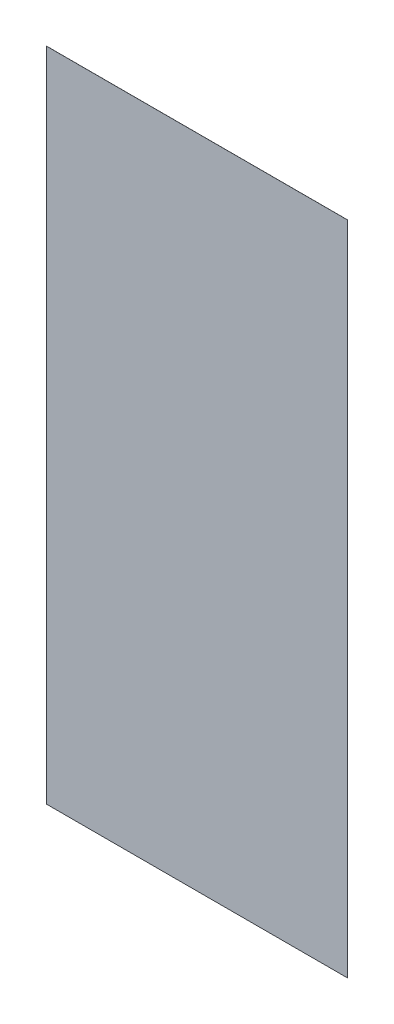
ISO-10303-21;
HEADER;
FILE_DESCRIPTION(('STEP AP214'),'2;1');
FILE_NAME('part.step','',(''),(''),'','','');
FILE_SCHEMA(('AUTOMOTIVE_DESIGN { 1 0 10303 214 1 1 1 1 }'));
ENDSEC;
DATA;
#1=APPLICATION_CONTEXT('core data for automotive mechanical design processes');
#2=APPLICATION_PROTOCOL_DEFINITION('international standard','automotive_design',2000,#1);
#3=PRODUCT_CONTEXT('',#1,'mechanical');
#4=PRODUCT('Part','Part','',(#3));
#5=PRODUCT_RELATED_PRODUCT_CATEGORY('part','',(#4));
#6=PRODUCT_DEFINITION_FORMATION('','',#4);
#7=PRODUCT_DEFINITION_CONTEXT('part definition',#1,'design');
#8=PRODUCT_DEFINITION('design','',#6,#7);
#9=PRODUCT_DEFINITION_SHAPE('','',#8);
#10=(LENGTH_UNIT() NAMED_UNIT(*) SI_UNIT(.MILLI.,.METRE.));
#11=(NAMED_UNIT(*) PLANE_ANGLE_UNIT() SI_UNIT($,.RADIAN.));
#12=(NAMED_UNIT(*) SI_UNIT($,.STERADIAN.) SOLID_ANGLE_UNIT());
#13=UNCERTAINTY_MEASURE_WITH_UNIT(LENGTH_MEASURE(1.E-05),#10,'distance_accuracy_value','');
#14=(GEOMETRIC_REPRESENTATION_CONTEXT(3) GLOBAL_UNCERTAINTY_ASSIGNED_CONTEXT((#13)) GLOBAL_UNIT_ASSIGNED_CONTEXT((#10,
#11,#12)) REPRESENTATION_CONTEXT('',''));
#15=CARTESIAN_POINT('',(0.,0.,0.));
#16=DIRECTION('',(0.,0.,1.));
#17=DIRECTION('',(1.,0.,0.));
#18=AXIS2_PLACEMENT_3D('',#15,#16,#17);
#19=CARTESIAN_POINT('',(120.65,0.,0.0254));
#20=DIRECTION('',(0.,1.,0.));
#21=DIRECTION('',(0.,0.,1.));
#22=AXIS2_PLACEMENT_3D('',#19,#20,#21);
#23=PLANE('',#22);
#24=DIRECTION('',(1.,0.,0.));
#25=VECTOR('',#24,1.);
#26=CARTESIAN_POINT('',(120.65,0.,0.));
#27=LINE('',#26,#25);
#28=CARTESIAN_POINT('',(0.,0.,0.));
#29=VERTEX_POINT('',#28);
#30=CARTESIAN_POINT('',(120.65,0.,0.));
#31=VERTEX_POINT('',#30);
#32=EDGE_CURVE('E107',#29,#31,#27,.T.);
#33=ORIENTED_EDGE('',*,*,#32,.T.);
#34=DIRECTION('',(0.,0.,-1.));
#35=VECTOR('',#34,1.);
#36=CARTESIAN_POINT('',(120.65,0.,0.0254));
#37=LINE('',#36,#35);
#38=CARTESIAN_POINT('',(120.65,0.,0.0254));
#39=VERTEX_POINT('',#38);
#40=EDGE_CURVE('E11',#39,#31,#37,.T.);
#41=ORIENTED_EDGE('',*,*,#40,.F.);
#42=DIRECTION('',(1.,0.,0.));
#43=VECTOR('',#42,1.);
#44=CARTESIAN_POINT('',(120.65,0.,0.0254));
#45=LINE('',#44,#43);
#46=CARTESIAN_POINT('',(0.,0.,0.0254));
#47=VERTEX_POINT('',#46);
#48=EDGE_CURVE('E91',#47,#39,#45,.T.);
#49=ORIENTED_EDGE('',*,*,#48,.F.);
#50=DIRECTION('',(0.,0.,-1.));
#51=VECTOR('',#50,1.);
#52=CARTESIAN_POINT('',(0.,0.,0.0254));
#53=LINE('',#52,#51);
#54=EDGE_CURVE('E103',#47,#29,#53,.T.);
#55=ORIENTED_EDGE('',*,*,#54,.T.);
#56=EDGE_LOOP('',(#33,#41,#49,#55));
#57=FACE_BOUND('',#56,.T.);
#58=ADVANCED_FACE('F39',(#57),#23,.F.);
#59=CARTESIAN_POINT('',(120.65,262.89,0.0254));
#60=DIRECTION('',(-1.,0.,0.));
#61=DIRECTION('',(0.,0.,1.));
#62=AXIS2_PLACEMENT_3D('',#59,#60,#61);
#63=PLANE('',#62);
#64=DIRECTION('',(0.,1.,0.));
#65=VECTOR('',#64,1.);
#66=CARTESIAN_POINT('',(120.65,262.89,0.));
#67=LINE('',#66,#65);
#68=CARTESIAN_POINT('',(120.65,262.89,0.));
#69=VERTEX_POINT('',#68);
#70=EDGE_CURVE('E96',#31,#69,#67,.T.);
#71=ORIENTED_EDGE('',*,*,#70,.T.);
#72=DIRECTION('',(0.,0.,-1.));
#73=VECTOR('',#72,1.);
#74=CARTESIAN_POINT('',(120.65,262.89,0.0254));
#75=LINE('',#74,#73);
#76=CARTESIAN_POINT('',(120.65,262.89,0.0254));
#77=VERTEX_POINT('',#76);
#78=EDGE_CURVE('E48',#77,#69,#75,.T.);
#79=ORIENTED_EDGE('',*,*,#78,.F.);
#80=DIRECTION('',(0.,1.,0.));
#81=VECTOR('',#80,1.);
#82=CARTESIAN_POINT('',(120.65,262.89,0.0254));
#83=LINE('',#82,#81);
#84=EDGE_CURVE('E86',#39,#77,#83,.T.);
#85=ORIENTED_EDGE('',*,*,#84,.F.);
#86=ORIENTED_EDGE('',*,*,#40,.T.);
#87=EDGE_LOOP('',(#71,#79,#85,#86));
#88=FACE_BOUND('',#87,.T.);
#89=ADVANCED_FACE('F95',(#88),#63,.F.);
#90=CARTESIAN_POINT('',(0.,262.89,0.0254));
#91=DIRECTION('',(0.,-1.,0.));
#92=DIRECTION('',(0.,0.,-1.));
#93=AXIS2_PLACEMENT_3D('',#90,#91,#92);
#94=PLANE('',#93);
#95=DIRECTION('',(-1.,0.,0.));
#96=VECTOR('',#95,1.);
#97=CARTESIAN_POINT('',(0.,262.89,0.));
#98=LINE('',#97,#96);
#99=CARTESIAN_POINT('',(0.,262.89,0.));
#100=VERTEX_POINT('',#99);
#101=EDGE_CURVE('E73',#69,#100,#98,.T.);
#102=ORIENTED_EDGE('',*,*,#101,.T.);
#103=DIRECTION('',(0.,0.,-1.));
#104=VECTOR('',#103,1.);
#105=CARTESIAN_POINT('',(0.,262.89,0.0254));
#106=LINE('',#105,#104);
#107=CARTESIAN_POINT('',(0.,262.89,0.0254));
#108=VERTEX_POINT('',#107);
#109=EDGE_CURVE('E98',#108,#100,#106,.T.);
#110=ORIENTED_EDGE('',*,*,#109,.F.);
#111=DIRECTION('',(-1.,0.,0.));
#112=VECTOR('',#111,1.);
#113=CARTESIAN_POINT('',(0.,262.89,0.0254));
#114=LINE('',#113,#112);
#115=EDGE_CURVE('E89',#77,#108,#114,.T.);
#116=ORIENTED_EDGE('',*,*,#115,.F.);
#117=ORIENTED_EDGE('',*,*,#78,.T.);
#118=EDGE_LOOP('',(#102,#110,#116,#117));
#119=FACE_BOUND('',#118,.T.);
#120=ADVANCED_FACE('F99',(#119),#94,.F.);
#121=CARTESIAN_POINT('',(0.,0.,0.0254));
#122=DIRECTION('',(1.,0.,0.));
#123=DIRECTION('',(0.,0.,-1.));
#124=AXIS2_PLACEMENT_3D('',#121,#122,#123);
#125=PLANE('',#124);
#126=DIRECTION('',(0.,-1.,0.));
#127=VECTOR('',#126,1.);
#128=CARTESIAN_POINT('',(0.,0.,0.));
#129=LINE('',#128,#127);
#130=EDGE_CURVE('E79',#100,#29,#129,.T.);
#131=ORIENTED_EDGE('',*,*,#130,.T.);
#132=ORIENTED_EDGE('',*,*,#54,.F.);
#133=DIRECTION('',(0.,-1.,0.));
#134=VECTOR('',#133,1.);
#135=CARTESIAN_POINT('',(0.,0.,0.0254));
#136=LINE('',#135,#134);
#137=EDGE_CURVE('E56',#108,#47,#136,.T.);
#138=ORIENTED_EDGE('',*,*,#137,.F.);
#139=ORIENTED_EDGE('',*,*,#109,.T.);
#140=EDGE_LOOP('',(#131,#132,#138,#139));
#141=FACE_BOUND('',#140,.T.);
#142=ADVANCED_FACE('F120',(#141),#125,.F.);
#143=CARTESIAN_POINT('',(0.,0.,0.0254));
#144=DIRECTION('',(0.,0.,-1.));
#145=DIRECTION('',(-1.,0.,0.));
#146=AXIS2_PLACEMENT_3D('',#143,#144,#145);
#147=PLANE('',#146);
#148=ORIENTED_EDGE('',*,*,#48,.T.);
#149=ORIENTED_EDGE('',*,*,#84,.T.);
#150=ORIENTED_EDGE('',*,*,#115,.T.);
#151=ORIENTED_EDGE('',*,*,#137,.T.);
#152=EDGE_LOOP('',(#148,#149,#150,#151));
#153=FACE_BOUND('',#152,.T.);
#154=ADVANCED_FACE('F87',(#153),#147,.F.);
#155=CARTESIAN_POINT('',(0.,0.,0.));
#156=DIRECTION('',(0.,0.,-1.));
#157=DIRECTION('',(-1.,0.,0.));
#158=AXIS2_PLACEMENT_3D('',#155,#156,#157);
#159=PLANE('',#158);
#160=ORIENTED_EDGE('',*,*,#32,.F.);
#161=ORIENTED_EDGE('',*,*,#130,.F.);
#162=ORIENTED_EDGE('',*,*,#101,.F.);
#163=ORIENTED_EDGE('',*,*,#70,.F.);
#164=EDGE_LOOP('',(#160,#161,#162,#163));
#165=FACE_BOUND('',#164,.T.);
#166=ADVANCED_FACE('F123',(#165),#159,.T.);
#167=CLOSED_SHELL('',(#58,#89,#120,#142,#154,#166));
#168=MANIFOLD_SOLID_BREP('B2',#167);
#169=ADVANCED_BREP_SHAPE_REPRESENTATION('',(#18,#168),#14);
#170=SHAPE_DEFINITION_REPRESENTATION(#9,#169);
ENDSEC;
END-ISO-10303-21;
